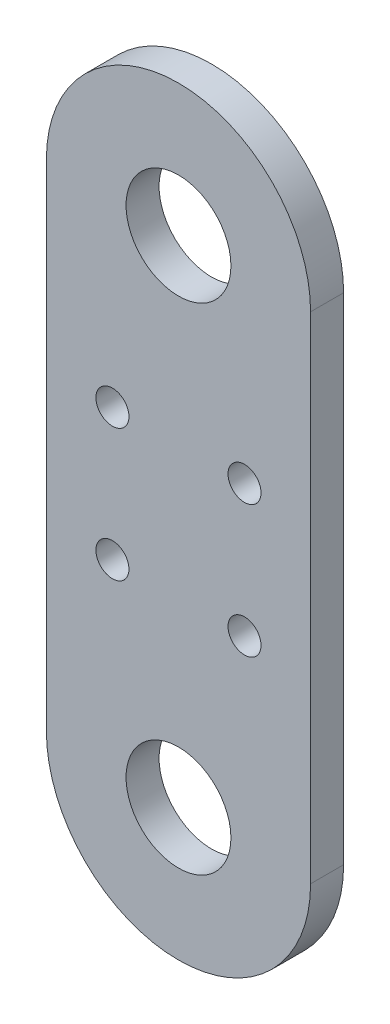
ISO-10303-21;
HEADER;
FILE_DESCRIPTION(('STEP AP214'),'2;1');
FILE_NAME('part.step','',(''),(''),'','','');
FILE_SCHEMA(('AUTOMOTIVE_DESIGN { 1 0 10303 214 1 1 1 1 }'));
ENDSEC;
DATA;
#1=APPLICATION_CONTEXT('core data for automotive mechanical design processes');
#2=APPLICATION_PROTOCOL_DEFINITION('international standard','automotive_design',2000,#1);
#3=PRODUCT_CONTEXT('',#1,'mechanical');
#4=PRODUCT('Part','Part','',(#3));
#5=PRODUCT_RELATED_PRODUCT_CATEGORY('part','',(#4));
#6=PRODUCT_DEFINITION_FORMATION('','',#4);
#7=PRODUCT_DEFINITION_CONTEXT('part definition',#1,'design');
#8=PRODUCT_DEFINITION('design','',#6,#7);
#9=PRODUCT_DEFINITION_SHAPE('','',#8);
#10=(LENGTH_UNIT() NAMED_UNIT(*) SI_UNIT(.MILLI.,.METRE.));
#11=(NAMED_UNIT(*) PLANE_ANGLE_UNIT() SI_UNIT($,.RADIAN.));
#12=(NAMED_UNIT(*) SI_UNIT($,.STERADIAN.) SOLID_ANGLE_UNIT());
#13=UNCERTAINTY_MEASURE_WITH_UNIT(LENGTH_MEASURE(1.E-05),#10,'distance_accuracy_value','');
#14=(GEOMETRIC_REPRESENTATION_CONTEXT(3) GLOBAL_UNCERTAINTY_ASSIGNED_CONTEXT((#13)) GLOBAL_UNIT_ASSIGNED_CONTEXT((#10,
#11,#12)) REPRESENTATION_CONTEXT('',''));
#15=CARTESIAN_POINT('',(0.,0.,0.));
#16=DIRECTION('',(0.,0.,1.));
#17=DIRECTION('',(1.,0.,0.));
#18=AXIS2_PLACEMENT_3D('',#15,#16,#17);
#19=CARTESIAN_POINT('',(0.,-23.8125,3.175));
#20=DIRECTION('',(0.,0.,-1.));
#21=DIRECTION('',(-1.,0.,0.));
#22=AXIS2_PLACEMENT_3D('',#19,#20,#21);
#23=CYLINDRICAL_SURFACE('',#22,12.7);
#24=CARTESIAN_POINT('',(0.,-23.8125,0.));
#25=DIRECTION('',(0.,0.,1.));
#26=DIRECTION('',(1.,0.,0.));
#27=AXIS2_PLACEMENT_3D('',#24,#25,#26);
#28=CIRCLE('',#27,12.7);
#29=CARTESIAN_POINT('',(-12.7,-23.8125,0.));
#30=VERTEX_POINT('',#29);
#31=CARTESIAN_POINT('',(12.7,-23.8125,0.));
#32=VERTEX_POINT('',#31);
#33=EDGE_CURVE('E95',#30,#32,#28,.T.);
#34=ORIENTED_EDGE('',*,*,#33,.T.);
#35=DIRECTION('',(0.,0.,-1.));
#36=VECTOR('',#35,1.);
#37=CARTESIAN_POINT('',(12.7,-23.8125,3.175));
#38=LINE('',#37,#36);
#39=CARTESIAN_POINT('',(12.7,-23.8125,3.175));
#40=VERTEX_POINT('',#39);
#41=EDGE_CURVE('E11',#40,#32,#38,.T.);
#42=ORIENTED_EDGE('',*,*,#41,.F.);
#43=CARTESIAN_POINT('',(0.,-23.8125,3.175));
#44=DIRECTION('',(0.,0.,1.));
#45=DIRECTION('',(1.,0.,0.));
#46=AXIS2_PLACEMENT_3D('',#43,#44,#45);
#47=CIRCLE('',#46,12.7);
#48=CARTESIAN_POINT('',(-12.7,-23.8125,3.175));
#49=VERTEX_POINT('',#48);
#50=EDGE_CURVE('E83',#49,#40,#47,.T.);
#51=ORIENTED_EDGE('',*,*,#50,.F.);
#52=DIRECTION('',(0.,0.,-1.));
#53=VECTOR('',#52,1.);
#54=CARTESIAN_POINT('',(-12.7,-23.8125,3.175));
#55=LINE('',#54,#53);
#56=EDGE_CURVE('E91',#49,#30,#55,.T.);
#57=ORIENTED_EDGE('',*,*,#56,.T.);
#58=EDGE_LOOP('',(#34,#42,#51,#57));
#59=FACE_BOUND('',#58,.T.);
#60=ADVANCED_FACE('F32',(#59),#23,.T.);
#61=CARTESIAN_POINT('',(12.7,-23.8125,3.175));
#62=DIRECTION('',(-1.,0.,0.));
#63=DIRECTION('',(0.,-1.,0.));
#64=AXIS2_PLACEMENT_3D('',#61,#62,#63);
#65=PLANE('',#64);
#66=DIRECTION('',(0.,1.,0.));
#67=VECTOR('',#66,1.);
#68=CARTESIAN_POINT('',(12.7,-23.8125,0.));
#69=LINE('',#68,#67);
#70=CARTESIAN_POINT('',(12.7,23.8125,0.));
#71=VERTEX_POINT('',#70);
#72=EDGE_CURVE('E87',#32,#71,#69,.T.);
#73=ORIENTED_EDGE('',*,*,#72,.T.);
#74=DIRECTION('',(0.,0.,-1.));
#75=VECTOR('',#74,1.);
#76=CARTESIAN_POINT('',(12.7,23.8125,3.175));
#77=LINE('',#76,#75);
#78=CARTESIAN_POINT('',(12.7,23.8125,3.175));
#79=VERTEX_POINT('',#78);
#80=EDGE_CURVE('E40',#79,#71,#77,.T.);
#81=ORIENTED_EDGE('',*,*,#80,.F.);
#82=DIRECTION('',(0.,1.,0.));
#83=VECTOR('',#82,1.);
#84=CARTESIAN_POINT('',(12.7,-23.8125,3.175));
#85=LINE('',#84,#83);
#86=EDGE_CURVE('E78',#40,#79,#85,.T.);
#87=ORIENTED_EDGE('',*,*,#86,.F.);
#88=ORIENTED_EDGE('',*,*,#41,.T.);
#89=EDGE_LOOP('',(#73,#81,#87,#88));
#90=FACE_BOUND('',#89,.T.);
#91=ADVANCED_FACE('F86',(#90),#65,.F.);
#92=CARTESIAN_POINT('',(0.,23.8125,3.175));
#93=DIRECTION('',(0.,0.,-1.));
#94=DIRECTION('',(-1.,0.,0.));
#95=AXIS2_PLACEMENT_3D('',#92,#93,#94);
#96=CYLINDRICAL_SURFACE('',#95,12.7);
#97=CARTESIAN_POINT('',(0.,23.8125,0.));
#98=DIRECTION('',(0.,0.,1.));
#99=DIRECTION('',(1.,0.,0.));
#100=AXIS2_PLACEMENT_3D('',#97,#98,#99);
#101=CIRCLE('',#100,12.7);
#102=CARTESIAN_POINT('',(-12.7,23.8125,0.));
#103=VERTEX_POINT('',#102);
#104=EDGE_CURVE('E65',#71,#103,#101,.T.);
#105=ORIENTED_EDGE('',*,*,#104,.T.);
#106=DIRECTION('',(0.,0.,-1.));
#107=VECTOR('',#106,1.);
#108=CARTESIAN_POINT('',(-12.7,23.8125,3.175));
#109=LINE('',#108,#107);
#110=CARTESIAN_POINT('',(-12.7,23.8125,3.175));
#111=VERTEX_POINT('',#110);
#112=EDGE_CURVE('E88',#111,#103,#109,.T.);
#113=ORIENTED_EDGE('',*,*,#112,.F.);
#114=CARTESIAN_POINT('',(0.,23.8125,3.175));
#115=DIRECTION('',(0.,0.,1.));
#116=DIRECTION('',(1.,0.,0.));
#117=AXIS2_PLACEMENT_3D('',#114,#115,#116);
#118=CIRCLE('',#117,12.7);
#119=EDGE_CURVE('E81',#79,#111,#118,.T.);
#120=ORIENTED_EDGE('',*,*,#119,.F.);
#121=ORIENTED_EDGE('',*,*,#80,.T.);
#122=EDGE_LOOP('',(#105,#113,#120,#121));
#123=FACE_BOUND('',#122,.T.);
#124=ADVANCED_FACE('F89',(#123),#96,.T.);
#125=CARTESIAN_POINT('',(-12.7,-23.8125,3.175));
#126=DIRECTION('',(1.,0.,0.));
#127=DIRECTION('',(0.,1.,0.));
#128=AXIS2_PLACEMENT_3D('',#125,#126,#127);
#129=PLANE('',#128);
#130=DIRECTION('',(0.,-1.,0.));
#131=VECTOR('',#130,1.);
#132=CARTESIAN_POINT('',(-12.7,-23.8125,0.));
#133=LINE('',#132,#131);
#134=EDGE_CURVE('E71',#103,#30,#133,.T.);
#135=ORIENTED_EDGE('',*,*,#134,.T.);
#136=ORIENTED_EDGE('',*,*,#56,.F.);
#137=DIRECTION('',(0.,-1.,0.));
#138=VECTOR('',#137,1.);
#139=CARTESIAN_POINT('',(-12.7,-23.8125,3.175));
#140=LINE('',#139,#138);
#141=EDGE_CURVE('E48',#111,#49,#140,.T.);
#142=ORIENTED_EDGE('',*,*,#141,.F.);
#143=ORIENTED_EDGE('',*,*,#112,.T.);
#144=EDGE_LOOP('',(#135,#136,#142,#143));
#145=FACE_BOUND('',#144,.T.);
#146=ADVANCED_FACE('F103',(#145),#129,.F.);
#147=CARTESIAN_POINT('',(0.,-23.8125,3.175));
#148=DIRECTION('',(0.,0.,1.));
#149=DIRECTION('',(1.,0.,0.));
#150=AXIS2_PLACEMENT_3D('',#147,#148,#149);
#151=PLANE('',#150);
#152=CARTESIAN_POINT('',(6.35,6.35,3.175));
#153=DIRECTION('',(0.,0.,1.));
#154=DIRECTION('',(1.,0.,0.));
#155=AXIS2_PLACEMENT_3D('',#152,#153,#154);
#156=CIRCLE('',#155,1.5875);
#157=CARTESIAN_POINT('',(7.9375,6.35,3.175));
#158=VERTEX_POINT('',#157);
#159=EDGE_CURVE('E141',#158,#158,#156,.T.);
#160=ORIENTED_EDGE('',*,*,#159,.F.);
#161=EDGE_LOOP('',(#160));
#162=FACE_BOUND('',#161,.T.);
#163=CARTESIAN_POINT('',(-6.35,-6.35,3.175));
#164=DIRECTION('',(0.,0.,1.));
#165=DIRECTION('',(1.,0.,0.));
#166=AXIS2_PLACEMENT_3D('',#163,#164,#165);
#167=CIRCLE('',#166,1.5875);
#168=CARTESIAN_POINT('',(-4.7625,-6.35,3.175));
#169=VERTEX_POINT('',#168);
#170=EDGE_CURVE('E135',#169,#169,#167,.T.);
#171=ORIENTED_EDGE('',*,*,#170,.F.);
#172=EDGE_LOOP('',(#171));
#173=FACE_BOUND('',#172,.T.);
#174=CARTESIAN_POINT('',(-6.35,6.35,3.175));
#175=DIRECTION('',(0.,0.,1.));
#176=DIRECTION('',(1.,0.,0.));
#177=AXIS2_PLACEMENT_3D('',#174,#175,#176);
#178=CIRCLE('',#177,1.5875);
#179=CARTESIAN_POINT('',(-4.7625,6.35,3.175));
#180=VERTEX_POINT('',#179);
#181=EDGE_CURVE('E129',#180,#180,#178,.T.);
#182=ORIENTED_EDGE('',*,*,#181,.F.);
#183=EDGE_LOOP('',(#182));
#184=FACE_BOUND('',#183,.T.);
#185=CARTESIAN_POINT('',(6.35,-6.35,3.175));
#186=DIRECTION('',(0.,0.,1.));
#187=DIRECTION('',(1.,0.,0.));
#188=AXIS2_PLACEMENT_3D('',#185,#186,#187);
#189=CIRCLE('',#188,1.5875);
#190=CARTESIAN_POINT('',(7.9375,-6.35,3.175));
#191=VERTEX_POINT('',#190);
#192=EDGE_CURVE('E123',#191,#191,#189,.T.);
#193=ORIENTED_EDGE('',*,*,#192,.F.);
#194=EDGE_LOOP('',(#193));
#195=FACE_BOUND('',#194,.T.);
#196=CARTESIAN_POINT('',(0.,23.8125,3.175));
#197=DIRECTION('',(0.,0.,1.));
#198=DIRECTION('',(1.,0.,0.));
#199=AXIS2_PLACEMENT_3D('',#196,#197,#198);
#200=CIRCLE('',#199,5.04189999999999);
#201=CARTESIAN_POINT('',(5.04189999999998,23.8125,3.175));
#202=VERTEX_POINT('',#201);
#203=EDGE_CURVE('E117',#202,#202,#200,.T.);
#204=ORIENTED_EDGE('',*,*,#203,.F.);
#205=EDGE_LOOP('',(#204));
#206=FACE_BOUND('',#205,.T.);
#207=CARTESIAN_POINT('',(0.,-23.8125,3.175));
#208=DIRECTION('',(0.,0.,1.));
#209=DIRECTION('',(1.,0.,0.));
#210=AXIS2_PLACEMENT_3D('',#207,#208,#209);
#211=CIRCLE('',#210,5.04189999999999);
#212=CARTESIAN_POINT('',(5.04189999999999,-23.8125,3.175));
#213=VERTEX_POINT('',#212);
#214=EDGE_CURVE('E111',#213,#213,#211,.T.);
#215=ORIENTED_EDGE('',*,*,#214,.F.);
#216=EDGE_LOOP('',(#215));
#217=FACE_BOUND('',#216,.T.);
#218=ORIENTED_EDGE('',*,*,#50,.T.);
#219=ORIENTED_EDGE('',*,*,#86,.T.);
#220=ORIENTED_EDGE('',*,*,#119,.T.);
#221=ORIENTED_EDGE('',*,*,#141,.T.);
#222=EDGE_LOOP('',(#218,#219,#220,#221));
#223=FACE_BOUND('',#222,.T.);
#224=ADVANCED_FACE('F79',(#162,#173,#184,#195,#206,#217,#223),#151,.T.);
#225=CARTESIAN_POINT('',(0.,-23.8125,0.));
#226=DIRECTION('',(0.,0.,1.));
#227=DIRECTION('',(1.,0.,0.));
#228=AXIS2_PLACEMENT_3D('',#225,#226,#227);
#229=PLANE('',#228);
#230=CARTESIAN_POINT('',(6.35,6.35,0.));
#231=DIRECTION('',(0.,0.,1.));
#232=DIRECTION('',(1.,0.,0.));
#233=AXIS2_PLACEMENT_3D('',#230,#231,#232);
#234=CIRCLE('',#233,1.5875);
#235=CARTESIAN_POINT('',(7.9375,6.35,0.));
#236=VERTEX_POINT('',#235);
#237=EDGE_CURVE('E138',#236,#236,#234,.T.);
#238=ORIENTED_EDGE('',*,*,#237,.T.);
#239=EDGE_LOOP('',(#238));
#240=FACE_BOUND('',#239,.T.);
#241=CARTESIAN_POINT('',(-6.35,-6.35,0.));
#242=DIRECTION('',(0.,0.,1.));
#243=DIRECTION('',(1.,0.,0.));
#244=AXIS2_PLACEMENT_3D('',#241,#242,#243);
#245=CIRCLE('',#244,1.5875);
#246=CARTESIAN_POINT('',(-4.7625,-6.35,0.));
#247=VERTEX_POINT('',#246);
#248=EDGE_CURVE('E132',#247,#247,#245,.T.);
#249=ORIENTED_EDGE('',*,*,#248,.T.);
#250=EDGE_LOOP('',(#249));
#251=FACE_BOUND('',#250,.T.);
#252=CARTESIAN_POINT('',(-6.35,6.35,0.));
#253=DIRECTION('',(0.,0.,1.));
#254=DIRECTION('',(1.,0.,0.));
#255=AXIS2_PLACEMENT_3D('',#252,#253,#254);
#256=CIRCLE('',#255,1.5875);
#257=CARTESIAN_POINT('',(-4.7625,6.35,0.));
#258=VERTEX_POINT('',#257);
#259=EDGE_CURVE('E126',#258,#258,#256,.T.);
#260=ORIENTED_EDGE('',*,*,#259,.T.);
#261=EDGE_LOOP('',(#260));
#262=FACE_BOUND('',#261,.T.);
#263=CARTESIAN_POINT('',(6.35,-6.35,0.));
#264=DIRECTION('',(0.,0.,1.));
#265=DIRECTION('',(1.,0.,0.));
#266=AXIS2_PLACEMENT_3D('',#263,#264,#265);
#267=CIRCLE('',#266,1.5875);
#268=CARTESIAN_POINT('',(7.9375,-6.35,0.));
#269=VERTEX_POINT('',#268);
#270=EDGE_CURVE('E120',#269,#269,#267,.T.);
#271=ORIENTED_EDGE('',*,*,#270,.T.);
#272=EDGE_LOOP('',(#271));
#273=FACE_BOUND('',#272,.T.);
#274=CARTESIAN_POINT('',(0.,23.8125,0.));
#275=DIRECTION('',(0.,0.,1.));
#276=DIRECTION('',(1.,0.,0.));
#277=AXIS2_PLACEMENT_3D('',#274,#275,#276);
#278=CIRCLE('',#277,5.0419);
#279=CARTESIAN_POINT('',(5.04189999999999,23.8125,0.));
#280=VERTEX_POINT('',#279);
#281=EDGE_CURVE('E114',#280,#280,#278,.T.);
#282=ORIENTED_EDGE('',*,*,#281,.T.);
#283=EDGE_LOOP('',(#282));
#284=FACE_BOUND('',#283,.T.);
#285=CARTESIAN_POINT('',(0.,-23.8125,0.));
#286=DIRECTION('',(0.,0.,1.));
#287=DIRECTION('',(1.,0.,0.));
#288=AXIS2_PLACEMENT_3D('',#285,#286,#287);
#289=CIRCLE('',#288,5.0419);
#290=CARTESIAN_POINT('',(5.0419,-23.8125,0.));
#291=VERTEX_POINT('',#290);
#292=EDGE_CURVE('E98',#291,#291,#289,.T.);
#293=ORIENTED_EDGE('',*,*,#292,.T.);
#294=EDGE_LOOP('',(#293));
#295=FACE_BOUND('',#294,.T.);
#296=ORIENTED_EDGE('',*,*,#33,.F.);
#297=ORIENTED_EDGE('',*,*,#134,.F.);
#298=ORIENTED_EDGE('',*,*,#104,.F.);
#299=ORIENTED_EDGE('',*,*,#72,.F.);
#300=EDGE_LOOP('',(#296,#297,#298,#299));
#301=FACE_BOUND('',#300,.T.);
#302=ADVANCED_FACE('F106',(#240,#251,#262,#273,#284,#295,#301),#229,.F.);
#303=CARTESIAN_POINT('',(0.,-23.8125,3.175));
#304=DIRECTION('',(0.,0.,1.));
#305=DIRECTION('',(1.,0.,0.));
#306=AXIS2_PLACEMENT_3D('',#303,#304,#305);
#307=CYLINDRICAL_SURFACE('',#306,5.04189999999999);
#308=ORIENTED_EDGE('',*,*,#292,.F.);
#309=EDGE_LOOP('',(#308));
#310=FACE_BOUND('',#309,.T.);
#311=ORIENTED_EDGE('',*,*,#214,.T.);
#312=EDGE_LOOP('',(#311));
#313=FACE_BOUND('',#312,.T.);
#314=ADVANCED_FACE('F160',(#310,#313),#307,.F.);
#315=CARTESIAN_POINT('',(0.,23.8125,3.175));
#316=DIRECTION('',(0.,0.,1.));
#317=DIRECTION('',(1.,0.,0.));
#318=AXIS2_PLACEMENT_3D('',#315,#316,#317);
#319=CYLINDRICAL_SURFACE('',#318,5.04189999999999);
#320=ORIENTED_EDGE('',*,*,#281,.F.);
#321=EDGE_LOOP('',(#320));
#322=FACE_BOUND('',#321,.T.);
#323=ORIENTED_EDGE('',*,*,#203,.T.);
#324=EDGE_LOOP('',(#323));
#325=FACE_BOUND('',#324,.T.);
#326=ADVANCED_FACE('F162',(#322,#325),#319,.F.);
#327=CARTESIAN_POINT('',(6.35,-6.35,3.175));
#328=DIRECTION('',(0.,0.,1.));
#329=DIRECTION('',(1.,0.,0.));
#330=AXIS2_PLACEMENT_3D('',#327,#328,#329);
#331=CYLINDRICAL_SURFACE('',#330,1.5875);
#332=ORIENTED_EDGE('',*,*,#270,.F.);
#333=EDGE_LOOP('',(#332));
#334=FACE_BOUND('',#333,.T.);
#335=ORIENTED_EDGE('',*,*,#192,.T.);
#336=EDGE_LOOP('',(#335));
#337=FACE_BOUND('',#336,.T.);
#338=ADVANCED_FACE('F169',(#334,#337),#331,.F.);
#339=CARTESIAN_POINT('',(-6.35,6.35,3.175));
#340=DIRECTION('',(0.,0.,1.));
#341=DIRECTION('',(1.,0.,0.));
#342=AXIS2_PLACEMENT_3D('',#339,#340,#341);
#343=CYLINDRICAL_SURFACE('',#342,1.5875);
#344=ORIENTED_EDGE('',*,*,#259,.F.);
#345=EDGE_LOOP('',(#344));
#346=FACE_BOUND('',#345,.T.);
#347=ORIENTED_EDGE('',*,*,#181,.T.);
#348=EDGE_LOOP('',(#347));
#349=FACE_BOUND('',#348,.T.);
#350=ADVANCED_FACE('F210',(#346,#349),#343,.F.);
#351=CARTESIAN_POINT('',(-6.35,-6.35,3.175));
#352=DIRECTION('',(0.,0.,1.));
#353=DIRECTION('',(1.,0.,0.));
#354=AXIS2_PLACEMENT_3D('',#351,#352,#353);
#355=CYLINDRICAL_SURFACE('',#354,1.5875);
#356=ORIENTED_EDGE('',*,*,#248,.F.);
#357=EDGE_LOOP('',(#356));
#358=FACE_BOUND('',#357,.T.);
#359=ORIENTED_EDGE('',*,*,#170,.T.);
#360=EDGE_LOOP('',(#359));
#361=FACE_BOUND('',#360,.T.);
#362=ADVANCED_FACE('F221',(#358,#361),#355,.F.);
#363=CARTESIAN_POINT('',(6.35,6.35,3.175));
#364=DIRECTION('',(0.,0.,1.));
#365=DIRECTION('',(1.,0.,0.));
#366=AXIS2_PLACEMENT_3D('',#363,#364,#365);
#367=CYLINDRICAL_SURFACE('',#366,1.5875);
#368=ORIENTED_EDGE('',*,*,#237,.F.);
#369=EDGE_LOOP('',(#368));
#370=FACE_BOUND('',#369,.T.);
#371=ORIENTED_EDGE('',*,*,#159,.T.);
#372=EDGE_LOOP('',(#371));
#373=FACE_BOUND('',#372,.T.);
#374=ADVANCED_FACE('F145',(#370,#373),#367,.F.);
#375=CLOSED_SHELL('',(#60,#91,#124,#146,#224,#302,#314,#326,#338,#350,#362,#374));
#376=MANIFOLD_SOLID_BREP('B2',#375);
#377=ADVANCED_BREP_SHAPE_REPRESENTATION('',(#18,#376),#14);
#378=SHAPE_DEFINITION_REPRESENTATION(#9,#377);
ENDSEC;
END-ISO-10303-21;
